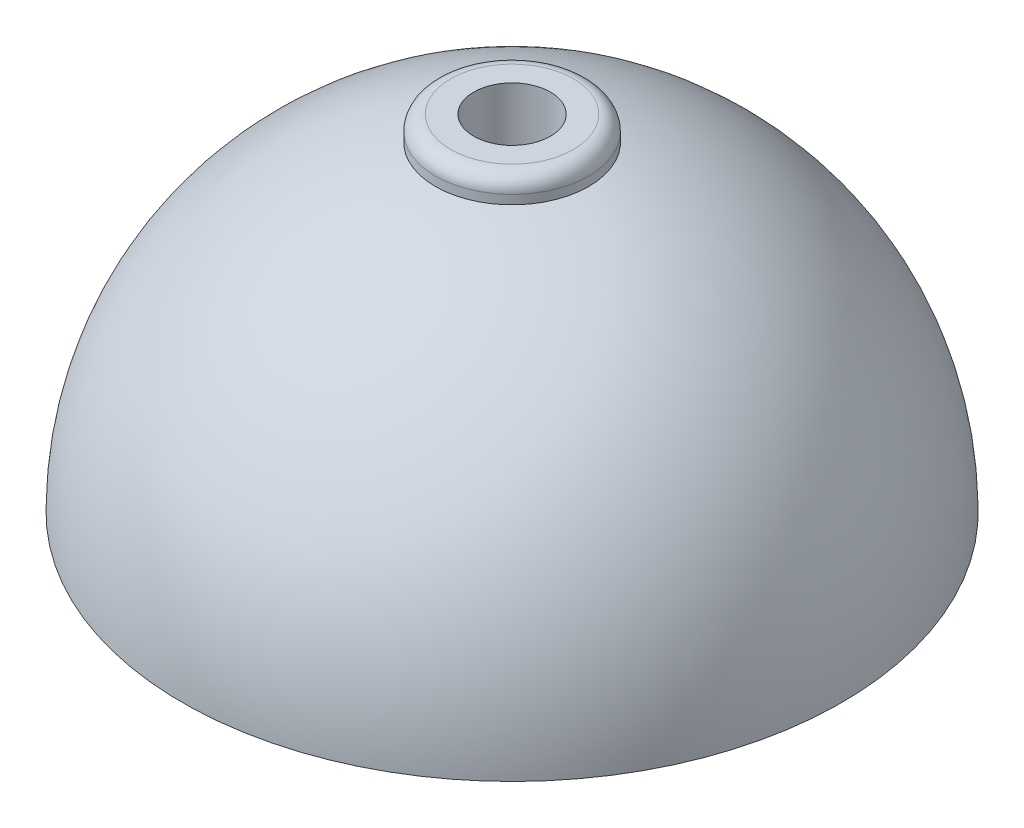
ISO-10303-21;
HEADER;
FILE_DESCRIPTION(('STEP AP214'),'2;1');
FILE_NAME('part.step','',(''),(''),'','','');
FILE_SCHEMA(('AUTOMOTIVE_DESIGN { 1 0 10303 214 1 1 1 1 }'));
ENDSEC;
DATA;
#1=APPLICATION_CONTEXT('core data for automotive mechanical design processes');
#2=APPLICATION_PROTOCOL_DEFINITION('international standard','automotive_design',2000,#1);
#3=PRODUCT_CONTEXT('',#1,'mechanical');
#4=PRODUCT('Part','Part','',(#3));
#5=PRODUCT_RELATED_PRODUCT_CATEGORY('part','',(#4));
#6=PRODUCT_DEFINITION_FORMATION('','',#4);
#7=PRODUCT_DEFINITION_CONTEXT('part definition',#1,'design');
#8=PRODUCT_DEFINITION('design','',#6,#7);
#9=PRODUCT_DEFINITION_SHAPE('','',#8);
#10=(LENGTH_UNIT() NAMED_UNIT(*) SI_UNIT(.MILLI.,.METRE.));
#11=(NAMED_UNIT(*) PLANE_ANGLE_UNIT() SI_UNIT($,.RADIAN.));
#12=(NAMED_UNIT(*) SI_UNIT($,.STERADIAN.) SOLID_ANGLE_UNIT());
#13=UNCERTAINTY_MEASURE_WITH_UNIT(LENGTH_MEASURE(1.E-05),#10,'distance_accuracy_value','');
#14=(GEOMETRIC_REPRESENTATION_CONTEXT(3) GLOBAL_UNCERTAINTY_ASSIGNED_CONTEXT((#13)) GLOBAL_UNIT_ASSIGNED_CONTEXT((#10,
#11,#12)) REPRESENTATION_CONTEXT('',''));
#15=CARTESIAN_POINT('',(0.,0.,0.));
#16=DIRECTION('',(0.,0.,1.));
#17=DIRECTION('',(1.,0.,0.));
#18=AXIS2_PLACEMENT_3D('',#15,#16,#17);
#19=CARTESIAN_POINT('',(0.,0.,0.));
#20=DIRECTION('',(0.,-1.,0.));
#21=DIRECTION('',(0.,0.,-1.));
#22=AXIS2_PLACEMENT_3D('',#19,#20,#21);
#23=PLANE('',#22);
#24=CARTESIAN_POINT('',(0.,0.,0.));
#25=DIRECTION('',(0.,-1.,0.));
#26=DIRECTION('',(0.,0.,-1.));
#27=AXIS2_PLACEMENT_3D('',#24,#25,#26);
#28=CIRCLE('',#27,19.5);
#29=CARTESIAN_POINT('',(0.,0.,-19.5));
#30=VERTEX_POINT('',#29);
#31=EDGE_CURVE('E52',#30,#30,#28,.T.);
#32=ORIENTED_EDGE('',*,*,#31,.F.);
#33=EDGE_LOOP('',(#32));
#34=FACE_BOUND('',#33,.T.);
#35=CARTESIAN_POINT('',(0.,0.,0.));
#36=DIRECTION('',(0.,-1.,0.));
#37=DIRECTION('',(0.,0.,-1.));
#38=AXIS2_PLACEMENT_3D('',#35,#36,#37);
#39=CIRCLE('',#38,21.5);
#40=CARTESIAN_POINT('',(0.,0.,-21.5));
#41=VERTEX_POINT('',#40);
#42=EDGE_CURVE('E46',#41,#41,#39,.T.);
#43=ORIENTED_EDGE('',*,*,#42,.T.);
#44=EDGE_LOOP('',(#43));
#45=FACE_BOUND('',#44,.T.);
#46=ADVANCED_FACE('F31',(#34,#45),#23,.T.);
#47=CARTESIAN_POINT('',(0.,0.,0.));
#48=DIRECTION('',(0.,-1.,0.));
#49=DIRECTION('',(1.,0.,0.));
#50=AXIS2_PLACEMENT_3D('',#47,#48,#49);
#51=SPHERICAL_SURFACE('',#50,21.5);
#52=CARTESIAN_POINT('',(0.,20.9105236663265,0.));
#53=DIRECTION('',(0.,-1.,0.));
#54=DIRECTION('',(0.,0.,-1.));
#55=AXIS2_PLACEMENT_3D('',#52,#53,#54);
#56=CIRCLE('',#55,5.);
#57=CARTESIAN_POINT('',(0.,20.9105236663265,-5.));
#58=VERTEX_POINT('',#57);
#59=EDGE_CURVE('E42',#58,#58,#56,.F.);
#60=ORIENTED_EDGE('',*,*,#59,.F.);
#61=EDGE_LOOP('',(#60));
#62=FACE_BOUND('',#61,.T.);
#63=ORIENTED_EDGE('',*,*,#42,.F.);
#64=EDGE_LOOP('',(#63));
#65=FACE_BOUND('',#64,.T.);
#66=ADVANCED_FACE('F83',(#62,#65),#51,.T.);
#67=CARTESIAN_POINT('',(0.,0.,0.));
#68=DIRECTION('',(0.,-1.,0.));
#69=DIRECTION('',(1.,0.,0.));
#70=AXIS2_PLACEMENT_3D('',#67,#68,#69);
#71=SPHERICAL_SURFACE('',#70,19.5);
#72=CARTESIAN_POINT('',(0.,18.8480768249708,0.));
#73=DIRECTION('',(0.,-1.,0.));
#74=DIRECTION('',(0.,0.,-1.));
#75=AXIS2_PLACEMENT_3D('',#72,#73,#74);
#76=CIRCLE('',#75,5.);
#77=CARTESIAN_POINT('',(0.,18.8480768249708,-5.));
#78=VERTEX_POINT('',#77);
#79=EDGE_CURVE('E49',#78,#78,#76,.F.);
#80=ORIENTED_EDGE('',*,*,#79,.T.);
#81=EDGE_LOOP('',(#80));
#82=FACE_BOUND('',#81,.T.);
#83=ORIENTED_EDGE('',*,*,#31,.T.);
#84=EDGE_LOOP('',(#83));
#85=FACE_BOUND('',#84,.T.);
#86=ADVANCED_FACE('F88',(#82,#85),#71,.F.);
#87=CARTESIAN_POINT('',(0.,6.5,0.));
#88=DIRECTION('',(0.,1.,0.));
#89=DIRECTION('',(0.,0.,1.));
#90=AXIS2_PLACEMENT_3D('',#87,#88,#89);
#91=PLANE('',#90);
#92=CARTESIAN_POINT('',(0.,6.5,0.));
#93=DIRECTION('',(0.,1.,0.));
#94=DIRECTION('',(0.,0.,1.));
#95=AXIS2_PLACEMENT_3D('',#92,#93,#94);
#96=CIRCLE('',#95,2.5);
#97=CARTESIAN_POINT('',(0.,6.5,-2.5));
#98=VERTEX_POINT('',#97);
#99=EDGE_CURVE('E60',#98,#98,#96,.F.);
#100=ORIENTED_EDGE('',*,*,#99,.F.);
#101=EDGE_LOOP('',(#100));
#102=FACE_BOUND('',#101,.T.);
#103=CARTESIAN_POINT('',(0.,6.5,0.));
#104=DIRECTION('',(0.,1.,0.));
#105=DIRECTION('',(0.,0.,1.));
#106=AXIS2_PLACEMENT_3D('',#103,#104,#105);
#107=CIRCLE('',#106,5.);
#108=CARTESIAN_POINT('',(0.,6.5,5.));
#109=VERTEX_POINT('',#108);
#110=EDGE_CURVE('E53',#109,#109,#107,.T.);
#111=ORIENTED_EDGE('',*,*,#110,.F.);
#112=EDGE_LOOP('',(#111));
#113=FACE_BOUND('',#112,.T.);
#114=ADVANCED_FACE('F95',(#102,#113),#91,.F.);
#115=CARTESIAN_POINT('',(0.,6.5,0.));
#116=DIRECTION('',(0.,1.,0.));
#117=DIRECTION('',(0.,0.,1.));
#118=AXIS2_PLACEMENT_3D('',#115,#116,#117);
#119=CYLINDRICAL_SURFACE('',#118,5.);
#120=ORIENTED_EDGE('',*,*,#110,.T.);
#121=EDGE_LOOP('',(#120));
#122=FACE_BOUND('',#121,.T.);
#123=ORIENTED_EDGE('',*,*,#79,.F.);
#124=EDGE_LOOP('',(#123));
#125=FACE_BOUND('',#124,.T.);
#126=ADVANCED_FACE('F79',(#122,#125),#119,.T.);
#127=CARTESIAN_POINT('',(0.,21.5,0.));
#128=DIRECTION('',(0.,1.,0.));
#129=DIRECTION('',(0.,0.,1.));
#130=AXIS2_PLACEMENT_3D('',#127,#128,#129);
#131=CIRCLE('',#130,5.);
#132=CARTESIAN_POINT('',(0.,21.5,5.));
#133=VERTEX_POINT('',#132);
#134=EDGE_CURVE('E10',#133,#133,#131,.F.);
#135=ORIENTED_EDGE('',*,*,#134,.T.);
#136=EDGE_LOOP('',(#135));
#137=FACE_BOUND('',#136,.T.);
#138=ORIENTED_EDGE('',*,*,#59,.T.);
#139=EDGE_LOOP('',(#138));
#140=FACE_BOUND('',#139,.T.);
#141=ADVANCED_FACE('F72',(#137,#140),#119,.T.);
#142=CARTESIAN_POINT('',(0.,22.5,0.));
#143=DIRECTION('',(0.,1.,0.));
#144=DIRECTION('',(0.,0.,1.));
#145=AXIS2_PLACEMENT_3D('',#142,#143,#144);
#146=PLANE('',#145);
#147=CARTESIAN_POINT('',(0.,22.5,0.));
#148=DIRECTION('',(0.,1.,0.));
#149=DIRECTION('',(0.,0.,1.));
#150=AXIS2_PLACEMENT_3D('',#147,#148,#149);
#151=CIRCLE('',#150,4.);
#152=CARTESIAN_POINT('',(0.,22.5,4.));
#153=VERTEX_POINT('',#152);
#154=EDGE_CURVE('E38',#153,#153,#151,.T.);
#155=ORIENTED_EDGE('',*,*,#154,.T.);
#156=EDGE_LOOP('',(#155));
#157=FACE_BOUND('',#156,.T.);
#158=CARTESIAN_POINT('',(0.,22.5,0.));
#159=DIRECTION('',(0.,1.,0.));
#160=DIRECTION('',(0.,0.,1.));
#161=AXIS2_PLACEMENT_3D('',#158,#159,#160);
#162=CIRCLE('',#161,2.5);
#163=CARTESIAN_POINT('',(0.,22.5,-2.5));
#164=VERTEX_POINT('',#163);
#165=EDGE_CURVE('E63',#164,#164,#162,.T.);
#166=ORIENTED_EDGE('',*,*,#165,.F.);
#167=EDGE_LOOP('',(#166));
#168=FACE_BOUND('',#167,.T.);
#169=ADVANCED_FACE('F70',(#157,#168),#146,.T.);
#170=CARTESIAN_POINT('',(0.,22.5,0.));
#171=DIRECTION('',(0.,-1.,0.));
#172=DIRECTION('',(0.,0.,-1.));
#173=AXIS2_PLACEMENT_3D('',#170,#171,#172);
#174=CYLINDRICAL_SURFACE('',#173,2.5);
#175=CARTESIAN_POINT('',(0.,22.5,-2.5));
#176=CARTESIAN_POINT('',(0.,22.3333333333333,-2.5));
#177=CARTESIAN_POINT('',(0.,22.1666666666667,-2.5));
#178=CARTESIAN_POINT('',(0.,21.8333333333333,-2.5));
#179=CARTESIAN_POINT('',(0.,21.6666666666667,-2.5));
#180=CARTESIAN_POINT('',(0.,21.3333333333333,-2.5));
#181=CARTESIAN_POINT('',(0.,21.1666666666667,-2.5));
#182=CARTESIAN_POINT('',(0.,20.8333333333333,-2.5));
#183=CARTESIAN_POINT('',(0.,20.6666666666667,-2.5));
#184=CARTESIAN_POINT('',(0.,20.3333333333333,-2.5));
#185=CARTESIAN_POINT('',(0.,20.1666666666667,-2.5));
#186=CARTESIAN_POINT('',(0.,19.8333333333333,-2.5));
#187=CARTESIAN_POINT('',(0.,19.6666666666667,-2.5));
#188=CARTESIAN_POINT('',(0.,19.3333333333333,-2.5));
#189=CARTESIAN_POINT('',(0.,19.1666666666667,-2.5));
#190=CARTESIAN_POINT('',(0.,18.8333333333333,-2.5));
#191=CARTESIAN_POINT('',(0.,18.6666666666667,-2.5));
#192=CARTESIAN_POINT('',(0.,18.3333333333333,-2.5));
#193=CARTESIAN_POINT('',(0.,18.1666666666667,-2.5));
#194=CARTESIAN_POINT('',(0.,17.8333333333333,-2.5));
#195=CARTESIAN_POINT('',(0.,17.6666666666667,-2.5));
#196=CARTESIAN_POINT('',(0.,17.3333333333333,-2.5));
#197=CARTESIAN_POINT('',(0.,17.1666666666667,-2.5));
#198=CARTESIAN_POINT('',(0.,16.8333333333333,-2.5));
#199=CARTESIAN_POINT('',(0.,16.6666666666667,-2.5));
#200=CARTESIAN_POINT('',(0.,16.3333333333333,-2.5));
#201=CARTESIAN_POINT('',(0.,16.1666666666667,-2.5));
#202=CARTESIAN_POINT('',(0.,15.8333333333333,-2.5));
#203=CARTESIAN_POINT('',(0.,15.6666666666667,-2.5));
#204=CARTESIAN_POINT('',(0.,15.3333333333333,-2.5));
#205=CARTESIAN_POINT('',(0.,15.1666666666667,-2.5));
#206=CARTESIAN_POINT('',(0.,14.8333333333333,-2.5));
#207=CARTESIAN_POINT('',(0.,14.6666666666667,-2.5));
#208=CARTESIAN_POINT('',(0.,14.3333333333333,-2.5));
#209=CARTESIAN_POINT('',(0.,14.1666666666667,-2.5));
#210=CARTESIAN_POINT('',(0.,13.8333333333333,-2.5));
#211=CARTESIAN_POINT('',(0.,13.6666666666667,-2.5));
#212=CARTESIAN_POINT('',(0.,13.3333333333333,-2.5));
#213=CARTESIAN_POINT('',(0.,13.1666666666667,-2.5));
#214=CARTESIAN_POINT('',(0.,12.8333333333333,-2.5));
#215=CARTESIAN_POINT('',(0.,12.6666666666667,-2.5));
#216=CARTESIAN_POINT('',(0.,12.3333333333333,-2.5));
#217=CARTESIAN_POINT('',(0.,12.1666666666667,-2.5));
#218=CARTESIAN_POINT('',(0.,11.8333333333333,-2.5));
#219=CARTESIAN_POINT('',(0.,11.6666666666667,-2.5));
#220=CARTESIAN_POINT('',(0.,11.3333333333333,-2.5));
#221=CARTESIAN_POINT('',(0.,11.1666666666667,-2.5));
#222=CARTESIAN_POINT('',(0.,10.8333333333333,-2.5));
#223=CARTESIAN_POINT('',(0.,10.6666666666667,-2.5));
#224=CARTESIAN_POINT('',(0.,10.3333333333333,-2.5));
#225=CARTESIAN_POINT('',(0.,10.1666666666667,-2.5));
#226=CARTESIAN_POINT('',(0.,9.83333333333333,-2.5));
#227=CARTESIAN_POINT('',(0.,9.66666666666666,-2.5));
#228=CARTESIAN_POINT('',(0.,9.33333333333333,-2.5));
#229=CARTESIAN_POINT('',(0.,9.16666666666666,-2.5));
#230=CARTESIAN_POINT('',(0.,8.83333333333333,-2.5));
#231=CARTESIAN_POINT('',(0.,8.66666666666666,-2.5));
#232=CARTESIAN_POINT('',(0.,8.33333333333333,-2.5));
#233=CARTESIAN_POINT('',(0.,8.16666666666666,-2.5));
#234=CARTESIAN_POINT('',(0.,7.83333333333333,-2.5));
#235=CARTESIAN_POINT('',(0.,7.66666666666666,-2.5));
#236=CARTESIAN_POINT('',(0.,7.33333333333333,-2.5));
#237=CARTESIAN_POINT('',(0.,7.16666666666666,-2.5));
#238=CARTESIAN_POINT('',(0.,6.83333333333333,-2.5));
#239=CARTESIAN_POINT('',(0.,6.66666666666666,-2.5));
#240=CARTESIAN_POINT('',(0.,6.5,-2.5));
#241=B_SPLINE_CURVE_WITH_KNOTS('',3,(#175,#176,#177,#178,#179,#180,#181,#182,#183,#184,#185,
#186,#187,#188,#189,#190,#191,#192,#193,#194,#195,#196,#197,#198,#199,#200,#201,#202,#203,#204,
#205,#206,#207,#208,#209,#210,#211,#212,#213,#214,#215,#216,#217,#218,#219,#220,#221,#222,#223,
#224,#225,#226,#227,#228,#229,#230,#231,#232,#233,#234,#235,#236,#237,#238,#239,#240),
.UNSPECIFIED.,.F.,.F.,(4,2,2,2,2,2,2,2,2,2,2,2,2,2,2,2,2,2,2,2,2,2,2,2,2,2,2,2,2,2,2,2,4),(0.,
0.499999999999997,0.999999999999997,1.5,2.,2.5,3.,3.5,4.,4.5,5.,5.5,6.,6.5,7.,7.5,8.,8.5,9.,9.5,
10.,10.5,11.,11.5,12.,12.5,13.,13.5,14.,14.5,15.,15.5,16.),.UNSPECIFIED.);
#242=EDGE_CURVE('BSEAM67',#164,#98,#241,.T.);
#243=ORIENTED_EDGE('',*,*,#165,.T.);
#244=ORIENTED_EDGE('',*,*,#99,.T.);
#245=ORIENTED_EDGE('',*,*,#242,.T.);
#246=ORIENTED_EDGE('',*,*,#242,.F.);
#247=EDGE_LOOP('',(#243,#245,#244,#246));
#248=FACE_BOUND('',#247,.T.);
#249=ADVANCED_FACE('F67',(#248),#174,.F.);
#250=CARTESIAN_POINT('',(0.,21.5,0.));
#251=DIRECTION('',(0.,1.,0.));
#252=DIRECTION('',(0.,0.,1.));
#253=AXIS2_PLACEMENT_3D('',#250,#251,#252);
#254=TOROIDAL_SURFACE('',#253,4.,1.);
#255=ORIENTED_EDGE('',*,*,#134,.F.);
#256=EDGE_LOOP('',(#255));
#257=FACE_BOUND('',#256,.T.);
#258=ORIENTED_EDGE('',*,*,#154,.F.);
#259=EDGE_LOOP('',(#258));
#260=FACE_BOUND('',#259,.T.);
#261=ADVANCED_FACE('F33',(#257,#260),#254,.T.);
#262=CLOSED_SHELL('',(#46,#66,#86,#114,#126,#141,#169,#249,#261));
#263=MANIFOLD_SOLID_BREP('B2',#262);
#264=ADVANCED_BREP_SHAPE_REPRESENTATION('',(#18,#263),#14);
#265=SHAPE_DEFINITION_REPRESENTATION(#9,#264);
ENDSEC;
END-ISO-10303-21;
